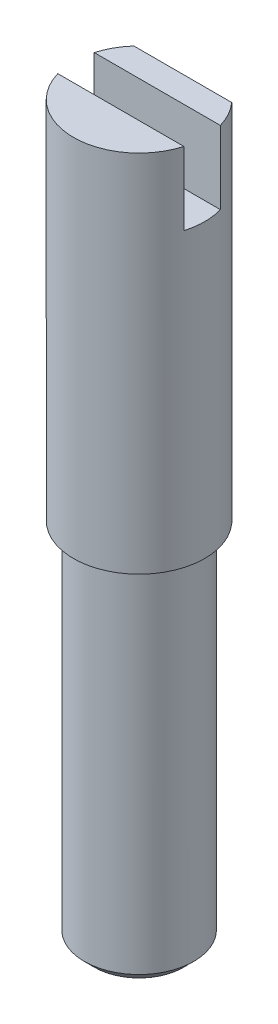
ISO-10303-21;
HEADER;
FILE_DESCRIPTION(('STEP AP214'),'2;1');
FILE_NAME('part.step','',(''),(''),'','','');
FILE_SCHEMA(('AUTOMOTIVE_DESIGN { 1 0 10303 214 1 1 1 1 }'));
ENDSEC;
DATA;
#1=APPLICATION_CONTEXT('core data for automotive mechanical design processes');
#2=APPLICATION_PROTOCOL_DEFINITION('international standard','automotive_design',2000,#1);
#3=PRODUCT_CONTEXT('',#1,'mechanical');
#4=PRODUCT('Part','Part','',(#3));
#5=PRODUCT_RELATED_PRODUCT_CATEGORY('part','',(#4));
#6=PRODUCT_DEFINITION_FORMATION('','',#4);
#7=PRODUCT_DEFINITION_CONTEXT('part definition',#1,'design');
#8=PRODUCT_DEFINITION('design','',#6,#7);
#9=PRODUCT_DEFINITION_SHAPE('','',#8);
#10=(LENGTH_UNIT() NAMED_UNIT(*) SI_UNIT(.MILLI.,.METRE.));
#11=(NAMED_UNIT(*) PLANE_ANGLE_UNIT() SI_UNIT($,.RADIAN.));
#12=(NAMED_UNIT(*) SI_UNIT($,.STERADIAN.) SOLID_ANGLE_UNIT());
#13=UNCERTAINTY_MEASURE_WITH_UNIT(LENGTH_MEASURE(1.E-05),#10,'distance_accuracy_value','');
#14=(GEOMETRIC_REPRESENTATION_CONTEXT(3) GLOBAL_UNCERTAINTY_ASSIGNED_CONTEXT((#13)) GLOBAL_UNIT_ASSIGNED_CONTEXT((#10,
#11,#12)) REPRESENTATION_CONTEXT('',''));
#15=CARTESIAN_POINT('',(0.,0.,0.));
#16=DIRECTION('',(0.,0.,1.));
#17=DIRECTION('',(1.,0.,0.));
#18=AXIS2_PLACEMENT_3D('',#15,#16,#17);
#19=CARTESIAN_POINT('',(0.,10.,0.));
#20=DIRECTION('',(0.,1.,0.));
#21=DIRECTION('',(0.,0.,1.));
#22=AXIS2_PLACEMENT_3D('',#19,#20,#21);
#23=PLANE('',#22);
#24=DIRECTION('',(-1.,0.,0.));
#25=VECTOR('',#24,1.);
#26=CARTESIAN_POINT('',(0.,10.,-0.5));
#27=LINE('',#26,#25);
#28=CARTESIAN_POINT('',(1.72916164657906,10.,-0.5));
#29=VERTEX_POINT('',#28);
#30=CARTESIAN_POINT('',(-1.72916164657906,10.,-0.5));
#31=VERTEX_POINT('',#30);
#32=EDGE_CURVE('E132',#29,#31,#27,.T.);
#33=ORIENTED_EDGE('',*,*,#32,.F.);
#34=CARTESIAN_POINT('',(0.,10.,0.));
#35=DIRECTION('',(0.,1.,0.));
#36=DIRECTION('',(0.,0.,1.));
#37=AXIS2_PLACEMENT_3D('',#34,#35,#36);
#38=CIRCLE('',#37,1.8);
#39=CARTESIAN_POINT('',(1.34164078649987,10.,-1.2));
#40=VERTEX_POINT('',#39);
#41=EDGE_CURVE('E107',#29,#40,#38,.T.);
#42=ORIENTED_EDGE('',*,*,#41,.T.);
#43=DIRECTION('',(-1.,0.,0.));
#44=VECTOR('',#43,1.);
#45=CARTESIAN_POINT('',(-1.34164078649987,10.,-1.2));
#46=LINE('',#45,#44);
#47=CARTESIAN_POINT('',(-1.34164078649987,10.,-1.2));
#48=VERTEX_POINT('',#47);
#49=EDGE_CURVE('E129',#40,#48,#46,.T.);
#50=ORIENTED_EDGE('',*,*,#49,.T.);
#51=EDGE_CURVE('E162',#48,#31,#38,.T.);
#52=ORIENTED_EDGE('',*,*,#51,.T.);
#53=EDGE_LOOP('',(#33,#42,#50,#52));
#54=FACE_BOUND('',#53,.T.);
#55=ADVANCED_FACE('F39',(#54),#23,.T.);
#56=CARTESIAN_POINT('',(0.,10.,0.));
#57=DIRECTION('',(0.,-1.,0.));
#58=DIRECTION('',(0.,0.,-1.));
#59=AXIS2_PLACEMENT_3D('',#56,#57,#58);
#60=CYLINDRICAL_SURFACE('',#59,1.8);
#61=ORIENTED_EDGE('',*,*,#41,.F.);
#62=DIRECTION('',(0.,-1.,0.));
#63=VECTOR('',#62,1.);
#64=CARTESIAN_POINT('',(1.72916164657906,10.,-0.5));
#65=LINE('',#64,#63);
#66=CARTESIAN_POINT('',(1.72916164657906,8.,-0.5));
#67=VERTEX_POINT('',#66);
#68=EDGE_CURVE('E155',#29,#67,#65,.T.);
#69=ORIENTED_EDGE('',*,*,#68,.T.);
#70=CARTESIAN_POINT('',(0.,8.,0.));
#71=DIRECTION('',(0.,1.,0.));
#72=DIRECTION('',(0.,0.,1.));
#73=AXIS2_PLACEMENT_3D('',#70,#71,#72);
#74=CIRCLE('',#73,1.8);
#75=CARTESIAN_POINT('',(1.72916164657906,8.,0.5));
#76=VERTEX_POINT('',#75);
#77=EDGE_CURVE('E11',#76,#67,#74,.T.);
#78=ORIENTED_EDGE('',*,*,#77,.F.);
#79=DIRECTION('',(0.,-1.,0.));
#80=VECTOR('',#79,1.);
#81=CARTESIAN_POINT('',(1.72916164657906,10.,0.5));
#82=LINE('',#81,#80);
#83=CARTESIAN_POINT('',(1.72916164657906,10.,0.5));
#84=VERTEX_POINT('',#83);
#85=EDGE_CURVE('E147',#76,#84,#82,.F.);
#86=ORIENTED_EDGE('',*,*,#85,.T.);
#87=CARTESIAN_POINT('',(-1.72916164657906,10.,0.5));
#88=VERTEX_POINT('',#87);
#89=EDGE_CURVE('E152',#88,#84,#38,.T.);
#90=ORIENTED_EDGE('',*,*,#89,.F.);
#91=DIRECTION('',(0.,-1.,0.));
#92=VECTOR('',#91,1.);
#93=CARTESIAN_POINT('',(-1.72916164657906,10.,0.5));
#94=LINE('',#93,#92);
#95=CARTESIAN_POINT('',(-1.72916164657906,8.,0.5));
#96=VERTEX_POINT('',#95);
#97=EDGE_CURVE('E62',#88,#96,#94,.T.);
#98=ORIENTED_EDGE('',*,*,#97,.T.);
#99=CARTESIAN_POINT('',(-1.72916164657906,8.,-0.5));
#100=VERTEX_POINT('',#99);
#101=EDGE_CURVE('E43',#100,#96,#74,.T.);
#102=ORIENTED_EDGE('',*,*,#101,.F.);
#103=DIRECTION('',(0.,-1.,0.));
#104=VECTOR('',#103,1.);
#105=CARTESIAN_POINT('',(-1.72916164657906,10.,-0.5));
#106=LINE('',#105,#104);
#107=EDGE_CURVE('E153',#100,#31,#106,.F.);
#108=ORIENTED_EDGE('',*,*,#107,.T.);
#109=ORIENTED_EDGE('',*,*,#51,.F.);
#110=DIRECTION('',(0.,-1.,0.));
#111=VECTOR('',#110,1.);
#112=CARTESIAN_POINT('',(-1.34164078649987,10.,-1.2));
#113=LINE('',#112,#111);
#114=CARTESIAN_POINT('',(-1.34164078649987,0.,-1.2));
#115=VERTEX_POINT('',#114);
#116=EDGE_CURVE('E126',#48,#115,#113,.T.);
#117=ORIENTED_EDGE('',*,*,#116,.T.);
#118=CARTESIAN_POINT('',(0.,0.,0.));
#119=DIRECTION('',(0.,1.,0.));
#120=DIRECTION('',(0.,0.,1.));
#121=AXIS2_PLACEMENT_3D('',#118,#119,#120);
#122=CIRCLE('',#121,1.8);
#123=CARTESIAN_POINT('',(1.34164078649987,0.,-1.2));
#124=VERTEX_POINT('',#123);
#125=EDGE_CURVE('E122',#115,#124,#122,.T.);
#126=ORIENTED_EDGE('',*,*,#125,.T.);
#127=DIRECTION('',(0.,-1.,0.));
#128=VECTOR('',#127,1.);
#129=CARTESIAN_POINT('',(1.34164078649987,10.,-1.2));
#130=LINE('',#129,#128);
#131=EDGE_CURVE('E105',#40,#124,#130,.T.);
#132=ORIENTED_EDGE('',*,*,#131,.F.);
#133=EDGE_LOOP('',(#61,#69,#78,#86,#90,#98,#102,#108,#109,#117,#126,#132));
#134=FACE_BOUND('',#133,.T.);
#135=ADVANCED_FACE('F41',(#134),#60,.T.);
#136=CARTESIAN_POINT('',(-1.34164078649987,10.,-1.2));
#137=DIRECTION('',(0.,0.,1.));
#138=DIRECTION('',(1.,0.,0.));
#139=AXIS2_PLACEMENT_3D('',#136,#137,#138);
#140=PLANE('',#139);
#141=DIRECTION('',(-1.,0.,0.));
#142=VECTOR('',#141,1.);
#143=CARTESIAN_POINT('',(-1.34164078649987,0.,-1.2));
#144=LINE('',#143,#142);
#145=CARTESIAN_POINT('',(0.899999999999999,0.,-1.2));
#146=VERTEX_POINT('',#145);
#147=EDGE_CURVE('E99',#124,#146,#144,.T.);
#148=ORIENTED_EDGE('',*,*,#147,.T.);
#149=CARTESIAN_POINT('',(-0.899999999999999,0.,-1.2));
#150=VERTEX_POINT('',#149);
#151=EDGE_CURVE('E102',#146,#150,#144,.T.);
#152=ORIENTED_EDGE('',*,*,#151,.T.);
#153=EDGE_CURVE('E54',#150,#115,#144,.T.);
#154=ORIENTED_EDGE('',*,*,#153,.T.);
#155=ORIENTED_EDGE('',*,*,#116,.F.);
#156=ORIENTED_EDGE('',*,*,#49,.F.);
#157=ORIENTED_EDGE('',*,*,#131,.T.);
#158=EDGE_LOOP('',(#148,#152,#154,#155,#156,#157));
#159=FACE_BOUND('',#158,.T.);
#160=ADVANCED_FACE('F100',(#159),#140,.F.);
#161=DIRECTION('',(1.,0.,0.));
#162=VECTOR('',#161,1.);
#163=CARTESIAN_POINT('',(0.,10.,0.5));
#164=LINE('',#163,#162);
#165=EDGE_CURVE('E131',#88,#84,#164,.T.);
#166=ORIENTED_EDGE('',*,*,#165,.F.);
#167=ORIENTED_EDGE('',*,*,#89,.T.);
#168=EDGE_LOOP('',(#166,#167));
#169=FACE_BOUND('',#168,.T.);
#170=ADVANCED_FACE('F169',(#169),#23,.T.);
#171=CARTESIAN_POINT('',(0.,0.,0.));
#172=DIRECTION('',(0.,1.,0.));
#173=DIRECTION('',(0.,0.,1.));
#174=AXIS2_PLACEMENT_3D('',#171,#172,#173);
#175=PLANE('',#174);
#176=ORIENTED_EDGE('',*,*,#153,.F.);
#177=CARTESIAN_POINT('',(0.,0.,0.));
#178=DIRECTION('',(0.,1.,0.));
#179=DIRECTION('',(0.,0.,1.));
#180=AXIS2_PLACEMENT_3D('',#177,#178,#179);
#181=CIRCLE('',#180,1.5);
#182=EDGE_CURVE('E109',#150,#146,#181,.T.);
#183=ORIENTED_EDGE('',*,*,#182,.T.);
#184=ORIENTED_EDGE('',*,*,#147,.F.);
#185=ORIENTED_EDGE('',*,*,#125,.F.);
#186=EDGE_LOOP('',(#176,#183,#184,#185));
#187=FACE_BOUND('',#186,.T.);
#188=ADVANCED_FACE('F111',(#187),#175,.F.);
#189=CARTESIAN_POINT('',(0.,8.,0.));
#190=DIRECTION('',(0.,1.,0.));
#191=DIRECTION('',(0.,0.,1.));
#192=AXIS2_PLACEMENT_3D('',#189,#190,#191);
#193=PLANE('',#192);
#194=ORIENTED_EDGE('',*,*,#77,.T.);
#195=DIRECTION('',(-1.,0.,0.));
#196=VECTOR('',#195,1.);
#197=CARTESIAN_POINT('',(-2.5,8.,-0.5));
#198=LINE('',#197,#196);
#199=EDGE_CURVE('E143',#67,#100,#198,.T.);
#200=ORIENTED_EDGE('',*,*,#199,.T.);
#201=ORIENTED_EDGE('',*,*,#101,.T.);
#202=DIRECTION('',(1.,0.,0.));
#203=VECTOR('',#202,1.);
#204=CARTESIAN_POINT('',(-2.5,8.,0.5));
#205=LINE('',#204,#203);
#206=EDGE_CURVE('E120',#96,#76,#205,.T.);
#207=ORIENTED_EDGE('',*,*,#206,.T.);
#208=EDGE_LOOP('',(#194,#200,#201,#207));
#209=FACE_BOUND('',#208,.T.);
#210=ADVANCED_FACE('F140',(#209),#193,.T.);
#211=CARTESIAN_POINT('',(-2.5,8.,-0.5));
#212=DIRECTION('',(0.,0.,-1.));
#213=DIRECTION('',(-1.,0.,0.));
#214=AXIS2_PLACEMENT_3D('',#211,#212,#213);
#215=PLANE('',#214);
#216=ORIENTED_EDGE('',*,*,#32,.T.);
#217=ORIENTED_EDGE('',*,*,#107,.F.);
#218=ORIENTED_EDGE('',*,*,#199,.F.);
#219=ORIENTED_EDGE('',*,*,#68,.F.);
#220=EDGE_LOOP('',(#216,#217,#218,#219));
#221=FACE_BOUND('',#220,.T.);
#222=ADVANCED_FACE('F167',(#221),#215,.F.);
#223=CARTESIAN_POINT('',(-2.5,8.,0.5));
#224=DIRECTION('',(0.,0.,1.));
#225=DIRECTION('',(1.,0.,0.));
#226=AXIS2_PLACEMENT_3D('',#223,#224,#225);
#227=PLANE('',#226);
#228=ORIENTED_EDGE('',*,*,#165,.T.);
#229=ORIENTED_EDGE('',*,*,#85,.F.);
#230=ORIENTED_EDGE('',*,*,#206,.F.);
#231=ORIENTED_EDGE('',*,*,#97,.F.);
#232=EDGE_LOOP('',(#228,#229,#230,#231));
#233=FACE_BOUND('',#232,.T.);
#234=ADVANCED_FACE('F145',(#233),#227,.F.);
#235=CARTESIAN_POINT('',(0.,0.,0.));
#236=DIRECTION('',(0.,-1.,0.));
#237=DIRECTION('',(0.,0.,-1.));
#238=AXIS2_PLACEMENT_3D('',#235,#236,#237);
#239=PLANE('',#238);
#240=ORIENTED_EDGE('',*,*,#151,.F.);
#241=EDGE_CURVE('E114',#146,#150,#181,.T.);
#242=ORIENTED_EDGE('',*,*,#241,.T.);
#243=EDGE_LOOP('',(#240,#242));
#244=FACE_BOUND('',#243,.T.);
#245=ADVANCED_FACE('F121',(#244),#239,.F.);
#246=CARTESIAN_POINT('',(0.,-10.,0.));
#247=DIRECTION('',(0.,1.,0.));
#248=DIRECTION('',(0.,0.,1.));
#249=AXIS2_PLACEMENT_3D('',#246,#247,#248);
#250=CYLINDRICAL_SURFACE('',#249,1.5);
#251=ORIENTED_EDGE('',*,*,#241,.F.);
#252=ORIENTED_EDGE('',*,*,#182,.F.);
#253=EDGE_LOOP('',(#251,#252));
#254=FACE_BOUND('',#253,.T.);
#255=CARTESIAN_POINT('',(0.,-9.7195,0.));
#256=DIRECTION('',(0.,1.,0.));
#257=DIRECTION('',(0.,0.,1.));
#258=AXIS2_PLACEMENT_3D('',#255,#256,#257);
#259=CIRCLE('',#258,1.5);
#260=CARTESIAN_POINT('',(0.,-9.7195,1.5));
#261=VERTEX_POINT('',#260);
#262=EDGE_CURVE('E278',#261,#261,#259,.T.);
#263=ORIENTED_EDGE('',*,*,#262,.T.);
#264=EDGE_LOOP('',(#263));
#265=FACE_BOUND('',#264,.T.);
#266=ADVANCED_FACE('F117',(#254,#265),#250,.T.);
#267=CARTESIAN_POINT('',(0.,-10.,0.));
#268=DIRECTION('',(0.,1.,0.));
#269=DIRECTION('',(0.,0.,1.));
#270=AXIS2_PLACEMENT_3D('',#267,#268,#269);
#271=CONICAL_SURFACE('',#270,1.2195,0.78539816339745);
#272=ORIENTED_EDGE('',*,*,#262,.F.);
#273=EDGE_LOOP('',(#272));
#274=FACE_BOUND('',#273,.T.);
#275=CARTESIAN_POINT('',(0.,-10.,0.));
#276=DIRECTION('',(0.,1.,0.));
#277=DIRECTION('',(0.,0.,1.));
#278=AXIS2_PLACEMENT_3D('',#275,#276,#277);
#279=CIRCLE('',#278,1.2195);
#280=CARTESIAN_POINT('',(0.,-10.,1.2195));
#281=VERTEX_POINT('',#280);
#282=EDGE_CURVE('E115',#281,#281,#279,.T.);
#283=ORIENTED_EDGE('',*,*,#282,.T.);
#284=EDGE_LOOP('',(#283));
#285=FACE_BOUND('',#284,.T.);
#286=ADVANCED_FACE('F221',(#274,#285),#271,.T.);
#287=CARTESIAN_POINT('',(0.,-10.,0.));
#288=DIRECTION('',(0.,-1.,0.));
#289=DIRECTION('',(0.,0.,-1.));
#290=AXIS2_PLACEMENT_3D('',#287,#288,#289);
#291=PLANE('',#290);
#292=ORIENTED_EDGE('',*,*,#282,.F.);
#293=EDGE_LOOP('',(#292));
#294=FACE_BOUND('',#293,.T.);
#295=ADVANCED_FACE('F233',(#294),#291,.T.);
#296=CLOSED_SHELL('',(#55,#135,#160,#170,#188,#210,#222,#234,#245,#266,#286,#295));
#297=MANIFOLD_SOLID_BREP('B2',#296);
#298=ADVANCED_BREP_SHAPE_REPRESENTATION('',(#18,#297),#14);
#299=SHAPE_DEFINITION_REPRESENTATION(#9,#298);
ENDSEC;
END-ISO-10303-21;
